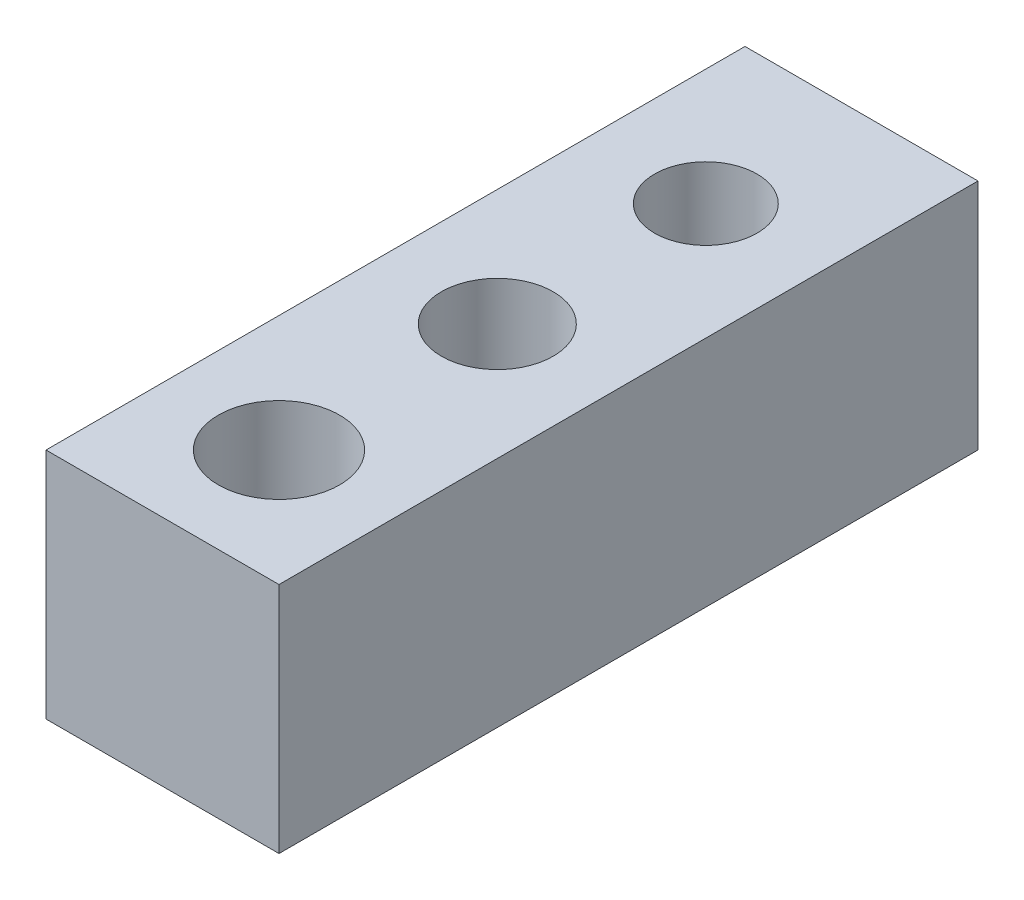
ISO-10303-21;
HEADER;
FILE_DESCRIPTION(('STEP AP214'),'2;1');
FILE_NAME('part.step','',(''),(''),'','','');
FILE_SCHEMA(('AUTOMOTIVE_DESIGN { 1 0 10303 214 1 1 1 1 }'));
ENDSEC;
DATA;
#1=APPLICATION_CONTEXT('core data for automotive mechanical design processes');
#2=APPLICATION_PROTOCOL_DEFINITION('international standard','automotive_design',2000,#1);
#3=PRODUCT_CONTEXT('',#1,'mechanical');
#4=PRODUCT('Part','Part','',(#3));
#5=PRODUCT_RELATED_PRODUCT_CATEGORY('part','',(#4));
#6=PRODUCT_DEFINITION_FORMATION('','',#4);
#7=PRODUCT_DEFINITION_CONTEXT('part definition',#1,'design');
#8=PRODUCT_DEFINITION('design','',#6,#7);
#9=PRODUCT_DEFINITION_SHAPE('','',#8);
#10=(LENGTH_UNIT() NAMED_UNIT(*) SI_UNIT(.MILLI.,.METRE.));
#11=(NAMED_UNIT(*) PLANE_ANGLE_UNIT() SI_UNIT($,.RADIAN.));
#12=(NAMED_UNIT(*) SI_UNIT($,.STERADIAN.) SOLID_ANGLE_UNIT());
#13=UNCERTAINTY_MEASURE_WITH_UNIT(LENGTH_MEASURE(1.E-05),#10,'distance_accuracy_value','');
#14=(GEOMETRIC_REPRESENTATION_CONTEXT(3) GLOBAL_UNCERTAINTY_ASSIGNED_CONTEXT((#13)) GLOBAL_UNIT_ASSIGNED_CONTEXT((#10,
#11,#12)) REPRESENTATION_CONTEXT('',''));
#15=CARTESIAN_POINT('',(0.,0.,0.));
#16=DIRECTION('',(0.,0.,1.));
#17=DIRECTION('',(1.,0.,0.));
#18=AXIS2_PLACEMENT_3D('',#15,#16,#17);
#19=CARTESIAN_POINT('',(-12.8804347826087,5.,-0.788043478260869));
#20=DIRECTION('',(1.,0.,0.));
#21=DIRECTION('',(0.,0.,-1.));
#22=AXIS2_PLACEMENT_3D('',#19,#20,#21);
#23=PLANE('',#22);
#24=DIRECTION('',(0.,0.,1.));
#25=VECTOR('',#24,1.);
#26=CARTESIAN_POINT('',(-12.8804347826087,0.,-0.788043478260869));
#27=LINE('',#26,#25);
#28=CARTESIAN_POINT('',(-12.8804347826087,0.,-0.788043478260869));
#29=VERTEX_POINT('',#28);
#30=CARTESIAN_POINT('',(-12.8804347826087,0.,14.2119565217391));
#31=VERTEX_POINT('',#30);
#32=EDGE_CURVE('E99',#29,#31,#27,.T.);
#33=ORIENTED_EDGE('',*,*,#32,.T.);
#34=DIRECTION('',(0.,-1.,0.));
#35=VECTOR('',#34,1.);
#36=CARTESIAN_POINT('',(-12.8804347826087,5.,14.2119565217391));
#37=LINE('',#36,#35);
#38=CARTESIAN_POINT('',(-12.8804347826087,5.,14.2119565217391));
#39=VERTEX_POINT('',#38);
#40=EDGE_CURVE('E11',#39,#31,#37,.T.);
#41=ORIENTED_EDGE('',*,*,#40,.F.);
#42=DIRECTION('',(0.,0.,1.));
#43=VECTOR('',#42,1.);
#44=CARTESIAN_POINT('',(-12.8804347826087,5.,-0.788043478260869));
#45=LINE('',#44,#43);
#46=CARTESIAN_POINT('',(-12.8804347826087,5.,-0.788043478260869));
#47=VERTEX_POINT('',#46);
#48=EDGE_CURVE('E87',#47,#39,#45,.T.);
#49=ORIENTED_EDGE('',*,*,#48,.F.);
#50=DIRECTION('',(0.,-1.,0.));
#51=VECTOR('',#50,1.);
#52=CARTESIAN_POINT('',(-12.8804347826087,5.,-0.788043478260869));
#53=LINE('',#52,#51);
#54=EDGE_CURVE('E95',#47,#29,#53,.T.);
#55=ORIENTED_EDGE('',*,*,#54,.T.);
#56=EDGE_LOOP('',(#33,#41,#49,#55));
#57=FACE_BOUND('',#56,.T.);
#58=ADVANCED_FACE('F36',(#57),#23,.F.);
#59=CARTESIAN_POINT('',(-12.8804347826087,5.,14.2119565217391));
#60=DIRECTION('',(0.,0.,-1.));
#61=DIRECTION('',(-1.,0.,0.));
#62=AXIS2_PLACEMENT_3D('',#59,#60,#61);
#63=PLANE('',#62);
#64=DIRECTION('',(1.,0.,0.));
#65=VECTOR('',#64,1.);
#66=CARTESIAN_POINT('',(-12.8804347826087,0.,14.2119565217391));
#67=LINE('',#66,#65);
#68=CARTESIAN_POINT('',(-7.88043478260871,0.,14.2119565217391));
#69=VERTEX_POINT('',#68);
#70=EDGE_CURVE('E91',#31,#69,#67,.T.);
#71=ORIENTED_EDGE('',*,*,#70,.T.);
#72=DIRECTION('',(0.,-1.,0.));
#73=VECTOR('',#72,1.);
#74=CARTESIAN_POINT('',(-7.88043478260871,5.,14.2119565217391));
#75=LINE('',#74,#73);
#76=CARTESIAN_POINT('',(-7.88043478260871,5.,14.2119565217391));
#77=VERTEX_POINT('',#76);
#78=EDGE_CURVE('E44',#77,#69,#75,.T.);
#79=ORIENTED_EDGE('',*,*,#78,.F.);
#80=DIRECTION('',(1.,0.,0.));
#81=VECTOR('',#80,1.);
#82=CARTESIAN_POINT('',(-12.8804347826087,5.,14.2119565217391));
#83=LINE('',#82,#81);
#84=EDGE_CURVE('E82',#39,#77,#83,.T.);
#85=ORIENTED_EDGE('',*,*,#84,.F.);
#86=ORIENTED_EDGE('',*,*,#40,.T.);
#87=EDGE_LOOP('',(#71,#79,#85,#86));
#88=FACE_BOUND('',#87,.T.);
#89=ADVANCED_FACE('F90',(#88),#63,.F.);
#90=CARTESIAN_POINT('',(-7.88043478260871,5.,-0.788043478260869));
#91=DIRECTION('',(-1.,0.,0.));
#92=DIRECTION('',(0.,0.,1.));
#93=AXIS2_PLACEMENT_3D('',#90,#91,#92);
#94=PLANE('',#93);
#95=DIRECTION('',(0.,0.,-1.));
#96=VECTOR('',#95,1.);
#97=CARTESIAN_POINT('',(-7.88043478260871,0.,-0.788043478260869));
#98=LINE('',#97,#96);
#99=CARTESIAN_POINT('',(-7.88043478260871,0.,-0.788043478260869));
#100=VERTEX_POINT('',#99);
#101=EDGE_CURVE('E69',#69,#100,#98,.T.);
#102=ORIENTED_EDGE('',*,*,#101,.T.);
#103=DIRECTION('',(0.,-1.,0.));
#104=VECTOR('',#103,1.);
#105=CARTESIAN_POINT('',(-7.88043478260871,5.,-0.788043478260869));
#106=LINE('',#105,#104);
#107=CARTESIAN_POINT('',(-7.88043478260871,5.,-0.788043478260869));
#108=VERTEX_POINT('',#107);
#109=EDGE_CURVE('E92',#108,#100,#106,.T.);
#110=ORIENTED_EDGE('',*,*,#109,.F.);
#111=DIRECTION('',(0.,0.,-1.));
#112=VECTOR('',#111,1.);
#113=CARTESIAN_POINT('',(-7.88043478260871,5.,-0.788043478260869));
#114=LINE('',#113,#112);
#115=EDGE_CURVE('E85',#77,#108,#114,.T.);
#116=ORIENTED_EDGE('',*,*,#115,.F.);
#117=ORIENTED_EDGE('',*,*,#78,.T.);
#118=EDGE_LOOP('',(#102,#110,#116,#117));
#119=FACE_BOUND('',#118,.T.);
#120=ADVANCED_FACE('F93',(#119),#94,.F.);
#121=CARTESIAN_POINT('',(-12.8804347826087,5.,-0.788043478260869));
#122=DIRECTION('',(0.,0.,1.));
#123=DIRECTION('',(1.,0.,0.));
#124=AXIS2_PLACEMENT_3D('',#121,#122,#123);
#125=PLANE('',#124);
#126=DIRECTION('',(-1.,0.,0.));
#127=VECTOR('',#126,1.);
#128=CARTESIAN_POINT('',(-12.8804347826087,0.,-0.788043478260869));
#129=LINE('',#128,#127);
#130=EDGE_CURVE('E75',#100,#29,#129,.T.);
#131=ORIENTED_EDGE('',*,*,#130,.T.);
#132=ORIENTED_EDGE('',*,*,#54,.F.);
#133=DIRECTION('',(-1.,0.,0.));
#134=VECTOR('',#133,1.);
#135=CARTESIAN_POINT('',(-12.8804347826087,5.,-0.788043478260869));
#136=LINE('',#135,#134);
#137=EDGE_CURVE('E52',#108,#47,#136,.T.);
#138=ORIENTED_EDGE('',*,*,#137,.F.);
#139=ORIENTED_EDGE('',*,*,#109,.T.);
#140=EDGE_LOOP('',(#131,#132,#138,#139));
#141=FACE_BOUND('',#140,.T.);
#142=ADVANCED_FACE('F107',(#141),#125,.F.);
#143=CARTESIAN_POINT('',(0.,5.,0.));
#144=DIRECTION('',(0.,1.,0.));
#145=DIRECTION('',(0.,0.,1.));
#146=AXIS2_PLACEMENT_3D('',#143,#144,#145);
#147=PLANE('',#146);
#148=CARTESIAN_POINT('',(-10.3804347826087,5.,11.7119565217391));
#149=DIRECTION('',(0.,1.,0.));
#150=DIRECTION('',(0.,0.,1.));
#151=AXIS2_PLACEMENT_3D('',#148,#149,#150);
#152=CIRCLE('',#151,1.3);
#153=CARTESIAN_POINT('',(-10.3804347826087,5.,13.0119565217391));
#154=VERTEX_POINT('',#153);
#155=EDGE_CURVE('E125',#154,#154,#152,.T.);
#156=ORIENTED_EDGE('',*,*,#155,.F.);
#157=EDGE_LOOP('',(#156));
#158=FACE_BOUND('',#157,.T.);
#159=CARTESIAN_POINT('',(-10.3804347826087,5.,2.55295503845332));
#160=DIRECTION('',(0.,1.,0.));
#161=DIRECTION('',(0.,0.,1.));
#162=AXIS2_PLACEMENT_3D('',#159,#160,#161);
#163=CIRCLE('',#162,1.1);
#164=CARTESIAN_POINT('',(-10.3804347826087,5.,3.65295503845332));
#165=VERTEX_POINT('',#164);
#166=EDGE_CURVE('E119',#165,#165,#163,.T.);
#167=ORIENTED_EDGE('',*,*,#166,.F.);
#168=EDGE_LOOP('',(#167));
#169=FACE_BOUND('',#168,.T.);
#170=CARTESIAN_POINT('',(-10.3804347826087,5.,7.02762262018553));
#171=DIRECTION('',(0.,1.,0.));
#172=DIRECTION('',(0.,0.,1.));
#173=AXIS2_PLACEMENT_3D('',#170,#171,#172);
#174=CIRCLE('',#173,1.2);
#175=CARTESIAN_POINT('',(-10.3804347826087,5.,8.22762262018552));
#176=VERTEX_POINT('',#175);
#177=EDGE_CURVE('E113',#176,#176,#174,.T.);
#178=ORIENTED_EDGE('',*,*,#177,.F.);
#179=EDGE_LOOP('',(#178));
#180=FACE_BOUND('',#179,.T.);
#181=ORIENTED_EDGE('',*,*,#48,.T.);
#182=ORIENTED_EDGE('',*,*,#84,.T.);
#183=ORIENTED_EDGE('',*,*,#115,.T.);
#184=ORIENTED_EDGE('',*,*,#137,.T.);
#185=EDGE_LOOP('',(#181,#182,#183,#184));
#186=FACE_BOUND('',#185,.T.);
#187=ADVANCED_FACE('F83',(#158,#169,#180,#186),#147,.T.);
#188=CARTESIAN_POINT('',(0.,0.,0.));
#189=DIRECTION('',(0.,1.,0.));
#190=DIRECTION('',(0.,0.,1.));
#191=AXIS2_PLACEMENT_3D('',#188,#189,#190);
#192=PLANE('',#191);
#193=CARTESIAN_POINT('',(-10.3804347826087,0.,11.7119565217391));
#194=DIRECTION('',(0.,1.,0.));
#195=DIRECTION('',(0.,0.,1.));
#196=AXIS2_PLACEMENT_3D('',#193,#194,#195);
#197=CIRCLE('',#196,1.3);
#198=CARTESIAN_POINT('',(-10.3804347826087,0.,13.0119565217391));
#199=VERTEX_POINT('',#198);
#200=EDGE_CURVE('E102',#199,#199,#197,.T.);
#201=ORIENTED_EDGE('',*,*,#200,.T.);
#202=EDGE_LOOP('',(#201));
#203=FACE_BOUND('',#202,.T.);
#204=CARTESIAN_POINT('',(-10.3804347826087,0.,2.55295503845332));
#205=DIRECTION('',(0.,1.,0.));
#206=DIRECTION('',(0.,0.,1.));
#207=AXIS2_PLACEMENT_3D('',#204,#205,#206);
#208=CIRCLE('',#207,1.1);
#209=CARTESIAN_POINT('',(-10.3804347826087,0.,3.65295503845332));
#210=VERTEX_POINT('',#209);
#211=EDGE_CURVE('E122',#210,#210,#208,.T.);
#212=ORIENTED_EDGE('',*,*,#211,.T.);
#213=EDGE_LOOP('',(#212));
#214=FACE_BOUND('',#213,.T.);
#215=CARTESIAN_POINT('',(-10.3804347826087,0.,7.02762262018553));
#216=DIRECTION('',(0.,1.,0.));
#217=DIRECTION('',(0.,0.,1.));
#218=AXIS2_PLACEMENT_3D('',#215,#216,#217);
#219=CIRCLE('',#218,1.2);
#220=CARTESIAN_POINT('',(-10.3804347826087,0.,8.22762262018552));
#221=VERTEX_POINT('',#220);
#222=EDGE_CURVE('E116',#221,#221,#219,.T.);
#223=ORIENTED_EDGE('',*,*,#222,.T.);
#224=EDGE_LOOP('',(#223));
#225=FACE_BOUND('',#224,.T.);
#226=ORIENTED_EDGE('',*,*,#32,.F.);
#227=ORIENTED_EDGE('',*,*,#130,.F.);
#228=ORIENTED_EDGE('',*,*,#101,.F.);
#229=ORIENTED_EDGE('',*,*,#70,.F.);
#230=EDGE_LOOP('',(#226,#227,#228,#229));
#231=FACE_BOUND('',#230,.T.);
#232=ADVANCED_FACE('F110',(#203,#214,#225,#231),#192,.F.);
#233=CARTESIAN_POINT('',(-10.3804347826087,0.,7.02762262018553));
#234=DIRECTION('',(0.,1.,0.));
#235=DIRECTION('',(0.,0.,1.));
#236=AXIS2_PLACEMENT_3D('',#233,#234,#235);
#237=CYLINDRICAL_SURFACE('',#236,1.2);
#238=ORIENTED_EDGE('',*,*,#222,.F.);
#239=EDGE_LOOP('',(#238));
#240=FACE_BOUND('',#239,.T.);
#241=ORIENTED_EDGE('',*,*,#177,.T.);
#242=EDGE_LOOP('',(#241));
#243=FACE_BOUND('',#242,.T.);
#244=ADVANCED_FACE('F147',(#240,#243),#237,.F.);
#245=CARTESIAN_POINT('',(-10.3804347826087,0.,2.55295503845332));
#246=DIRECTION('',(0.,1.,0.));
#247=DIRECTION('',(0.,0.,1.));
#248=AXIS2_PLACEMENT_3D('',#245,#246,#247);
#249=CYLINDRICAL_SURFACE('',#248,1.1);
#250=ORIENTED_EDGE('',*,*,#211,.F.);
#251=EDGE_LOOP('',(#250));
#252=FACE_BOUND('',#251,.T.);
#253=ORIENTED_EDGE('',*,*,#166,.T.);
#254=EDGE_LOOP('',(#253));
#255=FACE_BOUND('',#254,.T.);
#256=ADVANCED_FACE('F136',(#252,#255),#249,.F.);
#257=CARTESIAN_POINT('',(-10.3804347826087,0.,11.7119565217391));
#258=DIRECTION('',(0.,1.,0.));
#259=DIRECTION('',(0.,0.,1.));
#260=AXIS2_PLACEMENT_3D('',#257,#258,#259);
#261=CYLINDRICAL_SURFACE('',#260,1.3);
#262=ORIENTED_EDGE('',*,*,#200,.F.);
#263=EDGE_LOOP('',(#262));
#264=FACE_BOUND('',#263,.T.);
#265=ORIENTED_EDGE('',*,*,#155,.T.);
#266=EDGE_LOOP('',(#265));
#267=FACE_BOUND('',#266,.T.);
#268=ADVANCED_FACE('F133',(#264,#267),#261,.F.);
#269=CLOSED_SHELL('',(#58,#89,#120,#142,#187,#232,#244,#256,#268));
#270=MANIFOLD_SOLID_BREP('B2',#269);
#271=ADVANCED_BREP_SHAPE_REPRESENTATION('',(#18,#270),#14);
#272=SHAPE_DEFINITION_REPRESENTATION(#9,#271);
ENDSEC;
END-ISO-10303-21;
